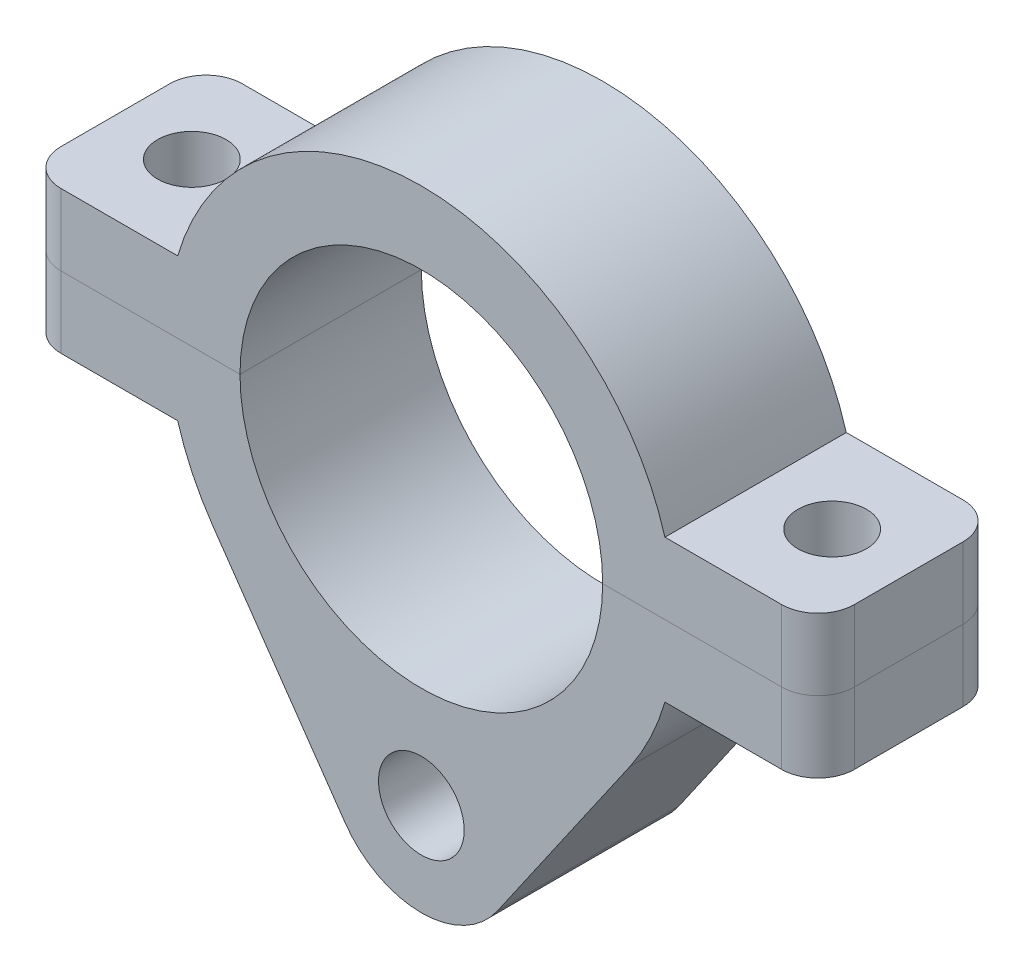
ISO-10303-21;
HEADER;
FILE_DESCRIPTION(('STEP AP214'),'2;1');
FILE_NAME('part.step','',(''),(''),'','','');
FILE_SCHEMA(('AUTOMOTIVE_DESIGN { 1 0 10303 214 1 1 1 1 }'));
ENDSEC;
DATA;
#1=APPLICATION_CONTEXT('core data for automotive mechanical design processes');
#2=APPLICATION_PROTOCOL_DEFINITION('international standard','automotive_design',2000,#1);
#3=PRODUCT_CONTEXT('',#1,'mechanical');
#4=PRODUCT('Part','Part','',(#3));
#5=PRODUCT_RELATED_PRODUCT_CATEGORY('part','',(#4));
#6=PRODUCT_DEFINITION_FORMATION('','',#4);
#7=PRODUCT_DEFINITION_CONTEXT('part definition',#1,'design');
#8=PRODUCT_DEFINITION('design','',#6,#7);
#9=PRODUCT_DEFINITION_SHAPE('','',#8);
#10=(LENGTH_UNIT() NAMED_UNIT(*) SI_UNIT(.MILLI.,.METRE.));
#11=(NAMED_UNIT(*) PLANE_ANGLE_UNIT() SI_UNIT($,.RADIAN.));
#12=(NAMED_UNIT(*) SI_UNIT($,.STERADIAN.) SOLID_ANGLE_UNIT());
#13=UNCERTAINTY_MEASURE_WITH_UNIT(LENGTH_MEASURE(1.E-05),#10,'distance_accuracy_value','');
#14=(GEOMETRIC_REPRESENTATION_CONTEXT(3) GLOBAL_UNCERTAINTY_ASSIGNED_CONTEXT((#13)) GLOBAL_UNIT_ASSIGNED_CONTEXT((#10,
#11,#12)) REPRESENTATION_CONTEXT('',''));
#15=CARTESIAN_POINT('',(0.,0.,0.));
#16=DIRECTION('',(0.,0.,1.));
#17=DIRECTION('',(1.,0.,0.));
#18=AXIS2_PLACEMENT_3D('',#15,#16,#17);
#19=CARTESIAN_POINT('',(0.,0.,0.));
#20=DIRECTION('',(0.,-1.,0.));
#21=DIRECTION('',(0.,0.,-1.));
#22=AXIS2_PLACEMENT_3D('',#19,#20,#21);
#23=PLANE('',#22);
#24=CARTESIAN_POINT('',(-22.4212425824144,0.,6.35));
#25=DIRECTION('',(0.,-1.,0.));
#26=DIRECTION('',(0.,0.,-1.));
#27=AXIS2_PLACEMENT_3D('',#24,#25,#26);
#28=CIRCLE('',#27,2.4);
#29=CARTESIAN_POINT('',(-22.4212425824144,0.,3.95));
#30=VERTEX_POINT('',#29);
#31=EDGE_CURVE('E179',#30,#30,#28,.F.);
#32=ORIENTED_EDGE('',*,*,#31,.T.);
#33=EDGE_LOOP('',(#32));
#34=FACE_BOUND('',#33,.T.);
#35=DIRECTION('',(1.,0.,0.));
#36=VECTOR('',#35,1.);
#37=CARTESIAN_POINT('',(0.,0.,12.7));
#38=LINE('',#37,#36);
#39=CARTESIAN_POINT('',(-25.24,0.,12.7));
#40=VERTEX_POINT('',#39);
#41=CARTESIAN_POINT('',(-12.7,0.,12.7));
#42=VERTEX_POINT('',#41);
#43=EDGE_CURVE('E172',#40,#42,#38,.T.);
#44=ORIENTED_EDGE('',*,*,#43,.F.);
#45=CARTESIAN_POINT('',(-25.24,0.,10.16));
#46=DIRECTION('',(0.,-1.,0.));
#47=DIRECTION('',(0.,0.,-1.));
#48=AXIS2_PLACEMENT_3D('',#45,#46,#47);
#49=CIRCLE('',#48,2.54);
#50=CARTESIAN_POINT('',(-27.78,0.,10.16));
#51=VERTEX_POINT('',#50);
#52=EDGE_CURVE('E236',#51,#40,#49,.F.);
#53=ORIENTED_EDGE('',*,*,#52,.F.);
#54=DIRECTION('',(0.,0.,1.));
#55=VECTOR('',#54,1.);
#56=CARTESIAN_POINT('',(-27.78,0.,12.7));
#57=LINE('',#56,#55);
#58=CARTESIAN_POINT('',(-27.78,0.,2.54));
#59=VERTEX_POINT('',#58);
#60=EDGE_CURVE('E239',#59,#51,#57,.T.);
#61=ORIENTED_EDGE('',*,*,#60,.F.);
#62=CARTESIAN_POINT('',(-25.24,0.,2.54));
#63=DIRECTION('',(0.,-1.,0.));
#64=DIRECTION('',(0.,0.,-1.));
#65=AXIS2_PLACEMENT_3D('',#62,#63,#64);
#66=CIRCLE('',#65,2.54);
#67=CARTESIAN_POINT('',(-25.24,0.,0.));
#68=VERTEX_POINT('',#67);
#69=EDGE_CURVE('E234',#68,#59,#66,.F.);
#70=ORIENTED_EDGE('',*,*,#69,.F.);
#71=DIRECTION('',(1.,0.,0.));
#72=VECTOR('',#71,1.);
#73=CARTESIAN_POINT('',(0.,0.,0.));
#74=LINE('',#73,#72);
#75=CARTESIAN_POINT('',(-12.7,0.,0.));
#76=VERTEX_POINT('',#75);
#77=EDGE_CURVE('E178',#68,#76,#74,.T.);
#78=ORIENTED_EDGE('',*,*,#77,.T.);
#79=DIRECTION('',(0.,0.,-1.));
#80=VECTOR('',#79,1.);
#81=CARTESIAN_POINT('',(-12.7,0.,12.7));
#82=LINE('',#81,#80);
#83=EDGE_CURVE('E158',#42,#76,#82,.T.);
#84=ORIENTED_EDGE('',*,*,#83,.F.);
#85=EDGE_LOOP('',(#44,#53,#61,#70,#78,#84));
#86=FACE_BOUND('',#85,.T.);
#87=ADVANCED_FACE('F53',(#34,#86),#23,.T.);
#88=CARTESIAN_POINT('',(22.4212425824144,0.,6.35));
#89=DIRECTION('',(0.,-1.,0.));
#90=DIRECTION('',(0.,0.,-1.));
#91=AXIS2_PLACEMENT_3D('',#88,#89,#90);
#92=CIRCLE('',#91,2.4);
#93=CARTESIAN_POINT('',(22.4212425824144,0.,3.95));
#94=VERTEX_POINT('',#93);
#95=EDGE_CURVE('E183',#94,#94,#92,.F.);
#96=ORIENTED_EDGE('',*,*,#95,.T.);
#97=EDGE_LOOP('',(#96));
#98=FACE_BOUND('',#97,.T.);
#99=CARTESIAN_POINT('',(12.7,0.,12.7));
#100=VERTEX_POINT('',#99);
#101=CARTESIAN_POINT('',(25.24,0.,12.7));
#102=VERTEX_POINT('',#101);
#103=EDGE_CURVE('E171',#100,#102,#38,.T.);
#104=ORIENTED_EDGE('',*,*,#103,.F.);
#105=DIRECTION('',(0.,0.,-1.));
#106=VECTOR('',#105,1.);
#107=CARTESIAN_POINT('',(12.7,0.,12.7));
#108=LINE('',#107,#106);
#109=CARTESIAN_POINT('',(12.7,0.,0.));
#110=VERTEX_POINT('',#109);
#111=EDGE_CURVE('E155',#110,#100,#108,.F.);
#112=ORIENTED_EDGE('',*,*,#111,.F.);
#113=CARTESIAN_POINT('',(25.24,0.,0.));
#114=VERTEX_POINT('',#113);
#115=EDGE_CURVE('E168',#110,#114,#74,.T.);
#116=ORIENTED_EDGE('',*,*,#115,.T.);
#117=CARTESIAN_POINT('',(25.24,0.,2.54));
#118=DIRECTION('',(0.,-1.,0.));
#119=DIRECTION('',(0.,0.,-1.));
#120=AXIS2_PLACEMENT_3D('',#117,#118,#119);
#121=CIRCLE('',#120,2.54);
#122=CARTESIAN_POINT('',(27.78,0.,2.54));
#123=VERTEX_POINT('',#122);
#124=EDGE_CURVE('E194',#123,#114,#121,.F.);
#125=ORIENTED_EDGE('',*,*,#124,.F.);
#126=DIRECTION('',(0.,0.,1.));
#127=VECTOR('',#126,1.);
#128=CARTESIAN_POINT('',(27.78,0.,12.7));
#129=LINE('',#128,#127);
#130=CARTESIAN_POINT('',(27.78,0.,10.16));
#131=VERTEX_POINT('',#130);
#132=EDGE_CURVE('E181',#123,#131,#129,.T.);
#133=ORIENTED_EDGE('',*,*,#132,.T.);
#134=CARTESIAN_POINT('',(25.24,0.,10.16));
#135=DIRECTION('',(0.,-1.,0.));
#136=DIRECTION('',(0.,0.,-1.));
#137=AXIS2_PLACEMENT_3D('',#134,#135,#136);
#138=CIRCLE('',#137,2.54);
#139=EDGE_CURVE('E232',#102,#131,#138,.F.);
#140=ORIENTED_EDGE('',*,*,#139,.F.);
#141=EDGE_LOOP('',(#104,#112,#116,#125,#133,#140));
#142=FACE_BOUND('',#141,.T.);
#143=ADVANCED_FACE('F167',(#98,#142),#23,.T.);
#144=CARTESIAN_POINT('',(0.,0.,12.7));
#145=DIRECTION('',(0.,0.,-1.));
#146=DIRECTION('',(-1.,0.,0.));
#147=AXIS2_PLACEMENT_3D('',#144,#145,#146);
#148=CYLINDRICAL_SURFACE('',#147,12.7);
#149=CARTESIAN_POINT('',(0.,0.,12.7));
#150=DIRECTION('',(0.,0.,1.));
#151=DIRECTION('',(1.,0.,0.));
#152=AXIS2_PLACEMENT_3D('',#149,#150,#151);
#153=CIRCLE('',#152,12.7);
#154=EDGE_CURVE('E212',#100,#42,#153,.T.);
#155=ORIENTED_EDGE('',*,*,#154,.T.);
#156=ORIENTED_EDGE('',*,*,#83,.T.);
#157=CARTESIAN_POINT('',(0.,0.,0.));
#158=DIRECTION('',(0.,0.,1.));
#159=DIRECTION('',(1.,0.,0.));
#160=AXIS2_PLACEMENT_3D('',#157,#158,#159);
#161=CIRCLE('',#160,12.7);
#162=EDGE_CURVE('E57',#110,#76,#161,.T.);
#163=ORIENTED_EDGE('',*,*,#162,.F.);
#164=ORIENTED_EDGE('',*,*,#111,.T.);
#165=EDGE_LOOP('',(#155,#156,#163,#164));
#166=FACE_BOUND('',#165,.T.);
#167=ADVANCED_FACE('F154',(#166),#148,.F.);
#168=CARTESIAN_POINT('',(0.,0.,12.7));
#169=DIRECTION('',(0.,0.,-1.));
#170=DIRECTION('',(-1.,0.,0.));
#171=AXIS2_PLACEMENT_3D('',#168,#169,#170);
#172=CYLINDRICAL_SURFACE('',#171,17.78);
#173=CARTESIAN_POINT('',(0.,0.,0.));
#174=DIRECTION('',(0.,0.,1.));
#175=DIRECTION('',(1.,0.,0.));
#176=AXIS2_PLACEMENT_3D('',#173,#174,#175);
#177=CIRCLE('',#176,17.78);
#178=CARTESIAN_POINT('',(17.0624851648287,5.,0.));
#179=VERTEX_POINT('',#178);
#180=CARTESIAN_POINT('',(-17.0624851648287,5.,0.));
#181=VERTEX_POINT('',#180);
#182=EDGE_CURVE('E224',#179,#181,#177,.T.);
#183=ORIENTED_EDGE('',*,*,#182,.T.);
#184=DIRECTION('',(0.,0.,-1.));
#185=VECTOR('',#184,1.);
#186=CARTESIAN_POINT('',(-17.0624851648287,5.,12.7));
#187=LINE('',#186,#185);
#188=CARTESIAN_POINT('',(-17.0624851648287,5.,12.7));
#189=VERTEX_POINT('',#188);
#190=EDGE_CURVE('E216',#189,#181,#187,.T.);
#191=ORIENTED_EDGE('',*,*,#190,.F.);
#192=CARTESIAN_POINT('',(0.,0.,12.7));
#193=DIRECTION('',(0.,0.,1.));
#194=DIRECTION('',(1.,0.,0.));
#195=AXIS2_PLACEMENT_3D('',#192,#193,#194);
#196=CIRCLE('',#195,17.78);
#197=CARTESIAN_POINT('',(17.0624851648287,5.,12.7));
#198=VERTEX_POINT('',#197);
#199=EDGE_CURVE('E214',#198,#189,#196,.T.);
#200=ORIENTED_EDGE('',*,*,#199,.F.);
#201=DIRECTION('',(0.,0.,-1.));
#202=VECTOR('',#201,1.);
#203=CARTESIAN_POINT('',(17.0624851648287,5.,12.7));
#204=LINE('',#203,#202);
#205=EDGE_CURVE('E72',#198,#179,#204,.T.);
#206=ORIENTED_EDGE('',*,*,#205,.T.);
#207=EDGE_LOOP('',(#183,#191,#200,#206));
#208=FACE_BOUND('',#207,.T.);
#209=ADVANCED_FACE('F285',(#208),#172,.T.);
#210=CARTESIAN_POINT('',(0.,5.,12.7));
#211=DIRECTION('',(0.,1.,0.));
#212=DIRECTION('',(0.,0.,1.));
#213=AXIS2_PLACEMENT_3D('',#210,#211,#212);
#214=PLANE('',#213);
#215=CARTESIAN_POINT('',(-22.4212425824144,5.,6.35));
#216=DIRECTION('',(0.,1.,0.));
#217=DIRECTION('',(0.,0.,1.));
#218=AXIS2_PLACEMENT_3D('',#215,#216,#217);
#219=CIRCLE('',#218,2.4);
#220=CARTESIAN_POINT('',(-22.4212425824144,5.,8.75));
#221=VERTEX_POINT('',#220);
#222=EDGE_CURVE('E63',#221,#221,#219,.T.);
#223=ORIENTED_EDGE('',*,*,#222,.F.);
#224=EDGE_LOOP('',(#223));
#225=FACE_BOUND('',#224,.T.);
#226=DIRECTION('',(0.,0.,-1.));
#227=VECTOR('',#226,1.);
#228=CARTESIAN_POINT('',(-27.78,5.,12.7));
#229=LINE('',#228,#227);
#230=CARTESIAN_POINT('',(-27.78,5.,10.16));
#231=VERTEX_POINT('',#230);
#232=CARTESIAN_POINT('',(-27.78,5.,2.54));
#233=VERTEX_POINT('',#232);
#234=EDGE_CURVE('E213',#231,#233,#229,.T.);
#235=ORIENTED_EDGE('',*,*,#234,.F.);
#236=CARTESIAN_POINT('',(-25.24,5.,10.16));
#237=DIRECTION('',(0.,1.,0.));
#238=DIRECTION('',(0.,0.,1.));
#239=AXIS2_PLACEMENT_3D('',#236,#237,#238);
#240=CIRCLE('',#239,2.54);
#241=CARTESIAN_POINT('',(-25.24,5.,12.7));
#242=VERTEX_POINT('',#241);
#243=EDGE_CURVE('E206',#231,#242,#240,.T.);
#244=ORIENTED_EDGE('',*,*,#243,.T.);
#245=DIRECTION('',(1.,0.,0.));
#246=VECTOR('',#245,1.);
#247=CARTESIAN_POINT('',(0.,5.,12.7));
#248=LINE('',#247,#246);
#249=EDGE_CURVE('E84',#242,#189,#248,.T.);
#250=ORIENTED_EDGE('',*,*,#249,.T.);
#251=ORIENTED_EDGE('',*,*,#190,.T.);
#252=DIRECTION('',(1.,0.,0.));
#253=VECTOR('',#252,1.);
#254=CARTESIAN_POINT('',(0.,5.,0.));
#255=LINE('',#254,#253);
#256=CARTESIAN_POINT('',(-25.24,5.,0.));
#257=VERTEX_POINT('',#256);
#258=EDGE_CURVE('E163',#257,#181,#255,.T.);
#259=ORIENTED_EDGE('',*,*,#258,.F.);
#260=CARTESIAN_POINT('',(-25.24,5.,2.54));
#261=DIRECTION('',(0.,1.,0.));
#262=DIRECTION('',(0.,0.,1.));
#263=AXIS2_PLACEMENT_3D('',#260,#261,#262);
#264=CIRCLE('',#263,2.54);
#265=EDGE_CURVE('E209',#257,#233,#264,.T.);
#266=ORIENTED_EDGE('',*,*,#265,.T.);
#267=EDGE_LOOP('',(#235,#244,#250,#251,#259,#266));
#268=FACE_BOUND('',#267,.T.);
#269=ADVANCED_FACE('F265',(#225,#268),#214,.T.);
#270=CARTESIAN_POINT('',(-27.78,0.,12.7));
#271=DIRECTION('',(-1.,0.,0.));
#272=DIRECTION('',(0.,0.,1.));
#273=AXIS2_PLACEMENT_3D('',#270,#271,#272);
#274=PLANE('',#273);
#275=DIRECTION('',(0.,1.,0.));
#276=VECTOR('',#275,1.);
#277=CARTESIAN_POINT('',(-27.78,-5.,2.54));
#278=LINE('',#277,#276);
#279=EDGE_CURVE('E208',#233,#59,#278,.F.);
#280=ORIENTED_EDGE('',*,*,#279,.T.);
#281=ORIENTED_EDGE('',*,*,#60,.T.);
#282=DIRECTION('',(0.,1.,0.));
#283=VECTOR('',#282,1.);
#284=CARTESIAN_POINT('',(-27.78,0.,10.16));
#285=LINE('',#284,#283);
#286=EDGE_CURVE('E92',#51,#231,#285,.T.);
#287=ORIENTED_EDGE('',*,*,#286,.T.);
#288=ORIENTED_EDGE('',*,*,#234,.T.);
#289=EDGE_LOOP('',(#280,#281,#287,#288));
#290=FACE_BOUND('',#289,.T.);
#291=ADVANCED_FACE('F284',(#290),#274,.T.);
#292=CARTESIAN_POINT('',(0.,5.,12.7));
#293=DIRECTION('',(0.,1.,0.));
#294=DIRECTION('',(0.,0.,1.));
#295=AXIS2_PLACEMENT_3D('',#292,#293,#294);
#296=PLANE('',#295);
#297=CARTESIAN_POINT('',(22.4212425824144,5.,6.35));
#298=DIRECTION('',(0.,1.,0.));
#299=DIRECTION('',(0.,0.,1.));
#300=AXIS2_PLACEMENT_3D('',#297,#298,#299);
#301=CIRCLE('',#300,2.4);
#302=CARTESIAN_POINT('',(22.4212425824144,5.,8.75));
#303=VERTEX_POINT('',#302);
#304=EDGE_CURVE('E13',#303,#303,#301,.T.);
#305=ORIENTED_EDGE('',*,*,#304,.F.);
#306=EDGE_LOOP('',(#305));
#307=FACE_BOUND('',#306,.T.);
#308=DIRECTION('',(1.,0.,0.));
#309=VECTOR('',#308,1.);
#310=CARTESIAN_POINT('',(0.,5.,12.7));
#311=LINE('',#310,#309);
#312=CARTESIAN_POINT('',(25.24,5.,12.7));
#313=VERTEX_POINT('',#312);
#314=EDGE_CURVE('E164',#198,#313,#311,.T.);
#315=ORIENTED_EDGE('',*,*,#314,.T.);
#316=CARTESIAN_POINT('',(25.24,5.,10.16));
#317=DIRECTION('',(0.,1.,0.));
#318=DIRECTION('',(0.,0.,1.));
#319=AXIS2_PLACEMENT_3D('',#316,#317,#318);
#320=CIRCLE('',#319,2.54);
#321=CARTESIAN_POINT('',(27.78,5.,10.16));
#322=VERTEX_POINT('',#321);
#323=EDGE_CURVE('E196',#313,#322,#320,.T.);
#324=ORIENTED_EDGE('',*,*,#323,.T.);
#325=DIRECTION('',(0.,0.,-1.));
#326=VECTOR('',#325,1.);
#327=CARTESIAN_POINT('',(27.78,5.,12.7));
#328=LINE('',#327,#326);
#329=CARTESIAN_POINT('',(27.78,5.,2.54));
#330=VERTEX_POINT('',#329);
#331=EDGE_CURVE('E211',#322,#330,#328,.T.);
#332=ORIENTED_EDGE('',*,*,#331,.T.);
#333=CARTESIAN_POINT('',(25.24,5.,2.54));
#334=DIRECTION('',(0.,1.,0.));
#335=DIRECTION('',(0.,0.,1.));
#336=AXIS2_PLACEMENT_3D('',#333,#334,#335);
#337=CIRCLE('',#336,2.54);
#338=CARTESIAN_POINT('',(25.24,5.,0.));
#339=VERTEX_POINT('',#338);
#340=EDGE_CURVE('E199',#330,#339,#337,.T.);
#341=ORIENTED_EDGE('',*,*,#340,.T.);
#342=DIRECTION('',(1.,0.,0.));
#343=VECTOR('',#342,1.);
#344=CARTESIAN_POINT('',(0.,5.,0.));
#345=LINE('',#344,#343);
#346=EDGE_CURVE('E226',#179,#339,#345,.T.);
#347=ORIENTED_EDGE('',*,*,#346,.F.);
#348=ORIENTED_EDGE('',*,*,#205,.F.);
#349=EDGE_LOOP('',(#315,#324,#332,#341,#347,#348));
#350=FACE_BOUND('',#349,.T.);
#351=ADVANCED_FACE('F269',(#307,#350),#296,.T.);
#352=CARTESIAN_POINT('',(0.,0.,0.));
#353=DIRECTION('',(0.,0.,1.));
#354=DIRECTION('',(1.,0.,0.));
#355=AXIS2_PLACEMENT_3D('',#352,#353,#354);
#356=PLANE('',#355);
#357=ORIENTED_EDGE('',*,*,#77,.F.);
#358=DIRECTION('',(0.,1.,0.));
#359=VECTOR('',#358,1.);
#360=CARTESIAN_POINT('',(-25.24,5.,0.));
#361=LINE('',#360,#359);
#362=EDGE_CURVE('E197',#68,#257,#361,.T.);
#363=ORIENTED_EDGE('',*,*,#362,.T.);
#364=ORIENTED_EDGE('',*,*,#258,.T.);
#365=ORIENTED_EDGE('',*,*,#182,.F.);
#366=ORIENTED_EDGE('',*,*,#346,.T.);
#367=DIRECTION('',(0.,1.,0.));
#368=VECTOR('',#367,1.);
#369=CARTESIAN_POINT('',(25.24,0.,0.));
#370=LINE('',#369,#368);
#371=EDGE_CURVE('E177',#339,#114,#370,.F.);
#372=ORIENTED_EDGE('',*,*,#371,.T.);
#373=ORIENTED_EDGE('',*,*,#115,.F.);
#374=ORIENTED_EDGE('',*,*,#162,.T.);
#375=EDGE_LOOP('',(#357,#363,#364,#365,#366,#372,#373,#374));
#376=FACE_BOUND('',#375,.T.);
#377=ADVANCED_FACE('F174',(#376),#356,.F.);
#378=CARTESIAN_POINT('',(27.78,0.,12.7));
#379=DIRECTION('',(-1.,0.,0.));
#380=DIRECTION('',(0.,0.,1.));
#381=AXIS2_PLACEMENT_3D('',#378,#379,#380);
#382=PLANE('',#381);
#383=ORIENTED_EDGE('',*,*,#132,.F.);
#384=DIRECTION('',(0.,1.,0.));
#385=VECTOR('',#384,1.);
#386=CARTESIAN_POINT('',(27.78,0.,2.54));
#387=LINE('',#386,#385);
#388=EDGE_CURVE('E193',#123,#330,#387,.T.);
#389=ORIENTED_EDGE('',*,*,#388,.T.);
#390=ORIENTED_EDGE('',*,*,#331,.F.);
#391=DIRECTION('',(0.,1.,0.));
#392=VECTOR('',#391,1.);
#393=CARTESIAN_POINT('',(27.78,-5.,10.16));
#394=LINE('',#393,#392);
#395=EDGE_CURVE('E190',#322,#131,#394,.F.);
#396=ORIENTED_EDGE('',*,*,#395,.T.);
#397=EDGE_LOOP('',(#383,#389,#390,#396));
#398=FACE_BOUND('',#397,.T.);
#399=ADVANCED_FACE('F247',(#398),#382,.F.);
#400=CARTESIAN_POINT('',(25.24,0.,2.54));
#401=DIRECTION('',(0.,1.,0.));
#402=DIRECTION('',(0.,0.,1.));
#403=AXIS2_PLACEMENT_3D('',#400,#401,#402);
#404=CYLINDRICAL_SURFACE('',#403,2.54);
#405=ORIENTED_EDGE('',*,*,#388,.F.);
#406=ORIENTED_EDGE('',*,*,#124,.T.);
#407=ORIENTED_EDGE('',*,*,#371,.F.);
#408=ORIENTED_EDGE('',*,*,#340,.F.);
#409=EDGE_LOOP('',(#405,#406,#407,#408));
#410=FACE_BOUND('',#409,.T.);
#411=ADVANCED_FACE('F55',(#410),#404,.T.);
#412=CARTESIAN_POINT('',(0.,0.,12.7));
#413=DIRECTION('',(0.,0.,1.));
#414=DIRECTION('',(1.,0.,0.));
#415=AXIS2_PLACEMENT_3D('',#412,#413,#414);
#416=PLANE('',#415);
#417=DIRECTION('',(0.,1.,0.));
#418=VECTOR('',#417,1.);
#419=CARTESIAN_POINT('',(-25.24,0.,12.7));
#420=LINE('',#419,#418);
#421=EDGE_CURVE('E201',#242,#40,#420,.F.);
#422=ORIENTED_EDGE('',*,*,#421,.T.);
#423=ORIENTED_EDGE('',*,*,#43,.T.);
#424=ORIENTED_EDGE('',*,*,#154,.F.);
#425=ORIENTED_EDGE('',*,*,#103,.T.);
#426=DIRECTION('',(0.,1.,0.));
#427=VECTOR('',#426,1.);
#428=CARTESIAN_POINT('',(25.24,5.,12.7));
#429=LINE('',#428,#427);
#430=EDGE_CURVE('E204',#102,#313,#429,.T.);
#431=ORIENTED_EDGE('',*,*,#430,.T.);
#432=ORIENTED_EDGE('',*,*,#314,.F.);
#433=ORIENTED_EDGE('',*,*,#199,.T.);
#434=ORIENTED_EDGE('',*,*,#249,.F.);
#435=EDGE_LOOP('',(#422,#423,#424,#425,#431,#432,#433,#434));
#436=FACE_BOUND('',#435,.T.);
#437=ADVANCED_FACE('F255',(#436),#416,.T.);
#438=CARTESIAN_POINT('',(25.24,0.,10.16));
#439=DIRECTION('',(0.,-1.,0.));
#440=DIRECTION('',(0.,0.,-1.));
#441=AXIS2_PLACEMENT_3D('',#438,#439,#440);
#442=CYLINDRICAL_SURFACE('',#441,2.54);
#443=ORIENTED_EDGE('',*,*,#430,.F.);
#444=ORIENTED_EDGE('',*,*,#139,.T.);
#445=ORIENTED_EDGE('',*,*,#395,.F.);
#446=ORIENTED_EDGE('',*,*,#323,.F.);
#447=EDGE_LOOP('',(#443,#444,#445,#446));
#448=FACE_BOUND('',#447,.T.);
#449=ADVANCED_FACE('F252',(#448),#442,.T.);
#450=CARTESIAN_POINT('',(-25.24,0.,2.54));
#451=DIRECTION('',(0.,-1.,0.));
#452=DIRECTION('',(0.,0.,-1.));
#453=AXIS2_PLACEMENT_3D('',#450,#451,#452);
#454=CYLINDRICAL_SURFACE('',#453,2.54);
#455=ORIENTED_EDGE('',*,*,#362,.F.);
#456=ORIENTED_EDGE('',*,*,#69,.T.);
#457=ORIENTED_EDGE('',*,*,#279,.F.);
#458=ORIENTED_EDGE('',*,*,#265,.F.);
#459=EDGE_LOOP('',(#455,#456,#457,#458));
#460=FACE_BOUND('',#459,.T.);
#461=ADVANCED_FACE('F262',(#460),#454,.T.);
#462=CARTESIAN_POINT('',(-25.24,0.,10.16));
#463=DIRECTION('',(0.,1.,0.));
#464=DIRECTION('',(0.,0.,1.));
#465=AXIS2_PLACEMENT_3D('',#462,#463,#464);
#466=CYLINDRICAL_SURFACE('',#465,2.54);
#467=ORIENTED_EDGE('',*,*,#286,.F.);
#468=ORIENTED_EDGE('',*,*,#52,.T.);
#469=ORIENTED_EDGE('',*,*,#421,.F.);
#470=ORIENTED_EDGE('',*,*,#243,.F.);
#471=EDGE_LOOP('',(#467,#468,#469,#470));
#472=FACE_BOUND('',#471,.T.);
#473=ADVANCED_FACE('F311',(#472),#466,.T.);
#474=CARTESIAN_POINT('',(22.4212425824144,-5.,6.35));
#475=DIRECTION('',(0.,-1.,0.));
#476=DIRECTION('',(0.,0.,-1.));
#477=AXIS2_PLACEMENT_3D('',#474,#475,#476);
#478=CYLINDRICAL_SURFACE('',#477,2.4);
#479=ORIENTED_EDGE('',*,*,#304,.T.);
#480=EDGE_LOOP('',(#479));
#481=FACE_BOUND('',#480,.T.);
#482=ORIENTED_EDGE('',*,*,#95,.F.);
#483=EDGE_LOOP('',(#482));
#484=FACE_BOUND('',#483,.T.);
#485=ADVANCED_FACE('F308',(#481,#484),#478,.F.);
#486=CARTESIAN_POINT('',(-22.4212425824144,-5.,6.35));
#487=DIRECTION('',(0.,-1.,0.));
#488=DIRECTION('',(0.,0.,-1.));
#489=AXIS2_PLACEMENT_3D('',#486,#487,#488);
#490=CYLINDRICAL_SURFACE('',#489,2.4);
#491=ORIENTED_EDGE('',*,*,#222,.T.);
#492=EDGE_LOOP('',(#491));
#493=FACE_BOUND('',#492,.T.);
#494=ORIENTED_EDGE('',*,*,#31,.F.);
#495=EDGE_LOOP('',(#494));
#496=FACE_BOUND('',#495,.T.);
#497=ADVANCED_FACE('F280',(#493,#496),#490,.F.);
#498=CLOSED_SHELL('',(#87,#143,#167,#209,#269,#291,#351,#377,#399,#411,#437,#449,#461,#473,#485,#497));
#499=MANIFOLD_SOLID_BREP('B2',#498);
#500=CARTESIAN_POINT('',(0.,0.,0.));
#501=DIRECTION('',(0.,-1.,0.));
#502=DIRECTION('',(0.,0.,-1.));
#503=AXIS2_PLACEMENT_3D('',#500,#501,#502);
#504=PLANE('',#503);
#505=DIRECTION('',(1.,0.,0.));
#506=VECTOR('',#505,1.);
#507=CARTESIAN_POINT('',(0.,0.,12.7));
#508=LINE('',#507,#506);
#509=CARTESIAN_POINT('',(-25.24,0.,12.7));
#510=VERTEX_POINT('',#509);
#511=CARTESIAN_POINT('',(-12.7,0.,12.7));
#512=VERTEX_POINT('',#511);
#513=EDGE_CURVE('E713',#510,#512,#508,.T.);
#514=ORIENTED_EDGE('',*,*,#513,.T.);
#515=DIRECTION('',(0.,0.,-1.));
#516=VECTOR('',#515,1.);
#517=CARTESIAN_POINT('',(-12.7,0.,12.7));
#518=LINE('',#517,#516);
#519=CARTESIAN_POINT('',(-12.7,0.,0.));
#520=VERTEX_POINT('',#519);
#521=EDGE_CURVE('E714',#512,#520,#518,.T.);
#522=ORIENTED_EDGE('',*,*,#521,.T.);
#523=DIRECTION('',(1.,0.,0.));
#524=VECTOR('',#523,1.);
#525=CARTESIAN_POINT('',(0.,0.,0.));
#526=LINE('',#525,#524);
#527=CARTESIAN_POINT('',(-25.24,0.,0.));
#528=VERTEX_POINT('',#527);
#529=EDGE_CURVE('E708',#528,#520,#526,.T.);
#530=ORIENTED_EDGE('',*,*,#529,.F.);
#531=CARTESIAN_POINT('',(-25.24,0.,2.54));
#532=DIRECTION('',(0.,-1.,0.));
#533=DIRECTION('',(0.,0.,-1.));
#534=AXIS2_PLACEMENT_3D('',#531,#532,#533);
#535=CIRCLE('',#534,2.54);
#536=CARTESIAN_POINT('',(-27.78,0.,2.54));
#537=VERTEX_POINT('',#536);
#538=EDGE_CURVE('E719',#528,#537,#535,.F.);
#539=ORIENTED_EDGE('',*,*,#538,.T.);
#540=DIRECTION('',(0.,0.,1.));
#541=VECTOR('',#540,1.);
#542=CARTESIAN_POINT('',(-27.78,0.,12.7));
#543=LINE('',#542,#541);
#544=CARTESIAN_POINT('',(-27.78,0.,10.16));
#545=VERTEX_POINT('',#544);
#546=EDGE_CURVE('E716',#537,#545,#543,.T.);
#547=ORIENTED_EDGE('',*,*,#546,.T.);
#548=CARTESIAN_POINT('',(-25.24,0.,10.16));
#549=DIRECTION('',(0.,-1.,0.));
#550=DIRECTION('',(0.,0.,-1.));
#551=AXIS2_PLACEMENT_3D('',#548,#549,#550);
#552=CIRCLE('',#551,2.54);
#553=EDGE_CURVE('E723',#545,#510,#552,.F.);
#554=ORIENTED_EDGE('',*,*,#553,.T.);
#555=EDGE_LOOP('',(#514,#522,#530,#539,#547,#554));
#556=FACE_BOUND('',#555,.T.);
#557=CARTESIAN_POINT('',(-22.4212425824144,0.,6.35));
#558=DIRECTION('',(0.,-1.,0.));
#559=DIRECTION('',(0.,0.,-1.));
#560=AXIS2_PLACEMENT_3D('',#557,#558,#559);
#561=CIRCLE('',#560,2.4);
#562=CARTESIAN_POINT('',(-22.4212425824144,0.,3.95));
#563=VERTEX_POINT('',#562);
#564=EDGE_CURVE('E533',#563,#563,#561,.F.);
#565=ORIENTED_EDGE('',*,*,#564,.F.);
#566=EDGE_LOOP('',(#565));
#567=FACE_BOUND('',#566,.T.);
#568=ADVANCED_FACE('F530',(#556,#567),#504,.F.);
#569=CARTESIAN_POINT('',(12.7,0.,12.7));
#570=VERTEX_POINT('',#569);
#571=CARTESIAN_POINT('',(25.24,0.,12.7));
#572=VERTEX_POINT('',#571);
#573=EDGE_CURVE('E720',#570,#572,#508,.T.);
#574=ORIENTED_EDGE('',*,*,#573,.T.);
#575=CARTESIAN_POINT('',(25.24,0.,10.16));
#576=DIRECTION('',(0.,-1.,0.));
#577=DIRECTION('',(0.,0.,-1.));
#578=AXIS2_PLACEMENT_3D('',#575,#576,#577);
#579=CIRCLE('',#578,2.54);
#580=CARTESIAN_POINT('',(27.78,0.,10.16));
#581=VERTEX_POINT('',#580);
#582=EDGE_CURVE('E538',#572,#581,#579,.F.);
#583=ORIENTED_EDGE('',*,*,#582,.T.);
#584=DIRECTION('',(0.,0.,1.));
#585=VECTOR('',#584,1.);
#586=CARTESIAN_POINT('',(27.78,0.,12.7));
#587=LINE('',#586,#585);
#588=CARTESIAN_POINT('',(27.78,0.,2.54));
#589=VERTEX_POINT('',#588);
#590=EDGE_CURVE('E710',#589,#581,#587,.T.);
#591=ORIENTED_EDGE('',*,*,#590,.F.);
#592=CARTESIAN_POINT('',(25.24,0.,2.54));
#593=DIRECTION('',(0.,-1.,0.));
#594=DIRECTION('',(0.,0.,-1.));
#595=AXIS2_PLACEMENT_3D('',#592,#593,#594);
#596=CIRCLE('',#595,2.54);
#597=CARTESIAN_POINT('',(25.24,0.,0.));
#598=VERTEX_POINT('',#597);
#599=EDGE_CURVE('E51',#589,#598,#596,.F.);
#600=ORIENTED_EDGE('',*,*,#599,.T.);
#601=CARTESIAN_POINT('',(12.7,0.,0.));
#602=VERTEX_POINT('',#601);
#603=EDGE_CURVE('E546',#602,#598,#526,.T.);
#604=ORIENTED_EDGE('',*,*,#603,.F.);
#605=DIRECTION('',(0.,0.,-1.));
#606=VECTOR('',#605,1.);
#607=CARTESIAN_POINT('',(12.7,0.,12.7));
#608=LINE('',#607,#606);
#609=EDGE_CURVE('E711',#602,#570,#608,.F.);
#610=ORIENTED_EDGE('',*,*,#609,.T.);
#611=EDGE_LOOP('',(#574,#583,#591,#600,#604,#610));
#612=FACE_BOUND('',#611,.T.);
#613=CARTESIAN_POINT('',(22.4212425824144,0.,6.35));
#614=DIRECTION('',(0.,-1.,0.));
#615=DIRECTION('',(0.,0.,-1.));
#616=AXIS2_PLACEMENT_3D('',#613,#614,#615);
#617=CIRCLE('',#616,2.4);
#618=CARTESIAN_POINT('',(22.4212425824144,0.,3.95));
#619=VERTEX_POINT('',#618);
#620=EDGE_CURVE('E706',#619,#619,#617,.F.);
#621=ORIENTED_EDGE('',*,*,#620,.F.);
#622=EDGE_LOOP('',(#621));
#623=FACE_BOUND('',#622,.T.);
#624=ADVANCED_FACE('F740',(#612,#623),#504,.F.);
#625=CARTESIAN_POINT('',(0.,0.,12.7));
#626=DIRECTION('',(0.,0.,-1.));
#627=DIRECTION('',(-1.,0.,0.));
#628=AXIS2_PLACEMENT_3D('',#625,#626,#627);
#629=CYLINDRICAL_SURFACE('',#628,17.78);
#630=CARTESIAN_POINT('',(0.,0.,0.));
#631=DIRECTION('',(0.,0.,1.));
#632=DIRECTION('',(1.,0.,0.));
#633=AXIS2_PLACEMENT_3D('',#630,#631,#632);
#634=CIRCLE('',#633,17.78);
#635=CARTESIAN_POINT('',(14.6168298070911,-10.1230769230769,0.));
#636=VERTEX_POINT('',#635);
#637=CARTESIAN_POINT('',(17.0624851648287,-5.,0.));
#638=VERTEX_POINT('',#637);
#639=EDGE_CURVE('E673',#636,#638,#634,.T.);
#640=ORIENTED_EDGE('',*,*,#639,.T.);
#641=DIRECTION('',(0.,0.,-1.));
#642=VECTOR('',#641,1.);
#643=CARTESIAN_POINT('',(17.0624851648287,-5.,12.7));
#644=LINE('',#643,#642);
#645=CARTESIAN_POINT('',(17.0624851648287,-5.,12.7));
#646=VERTEX_POINT('',#645);
#647=EDGE_CURVE('E650',#646,#638,#644,.T.);
#648=ORIENTED_EDGE('',*,*,#647,.F.);
#649=CARTESIAN_POINT('',(0.,0.,12.7));
#650=DIRECTION('',(0.,0.,1.));
#651=DIRECTION('',(1.,0.,0.));
#652=AXIS2_PLACEMENT_3D('',#649,#650,#651);
#653=CIRCLE('',#652,17.78);
#654=CARTESIAN_POINT('',(14.6168298070911,-10.1230769230769,12.7));
#655=VERTEX_POINT('',#654);
#656=EDGE_CURVE('E658',#655,#646,#653,.T.);
#657=ORIENTED_EDGE('',*,*,#656,.F.);
#658=DIRECTION('',(0.,0.,-1.));
#659=VECTOR('',#658,1.);
#660=CARTESIAN_POINT('',(14.6168298070911,-10.1230769230769,12.7));
#661=LINE('',#660,#659);
#662=EDGE_CURVE('E756',#655,#636,#661,.T.);
#663=ORIENTED_EDGE('',*,*,#662,.T.);
#664=EDGE_LOOP('',(#640,#648,#657,#663));
#665=FACE_BOUND('',#664,.T.);
#666=ADVANCED_FACE('F671',(#665),#629,.T.);
#667=CARTESIAN_POINT('',(0.,-5.,12.7));
#668=DIRECTION('',(0.,1.,0.));
#669=DIRECTION('',(0.,0.,1.));
#670=AXIS2_PLACEMENT_3D('',#667,#668,#669);
#671=PLANE('',#670);
#672=CARTESIAN_POINT('',(22.4212425824144,-5.,6.35));
#673=DIRECTION('',(0.,-1.,0.));
#674=DIRECTION('',(0.,0.,-1.));
#675=AXIS2_PLACEMENT_3D('',#672,#673,#674);
#676=CIRCLE('',#675,2.4);
#677=CARTESIAN_POINT('',(22.4212425824144,-5.,3.95));
#678=VERTEX_POINT('',#677);
#679=EDGE_CURVE('E1129',#678,#678,#676,.T.);
#680=ORIENTED_EDGE('',*,*,#679,.F.);
#681=EDGE_LOOP('',(#680));
#682=FACE_BOUND('',#681,.T.);
#683=DIRECTION('',(0.,0.,-1.));
#684=VECTOR('',#683,1.);
#685=CARTESIAN_POINT('',(27.78,-5.,12.7));
#686=LINE('',#685,#684);
#687=CARTESIAN_POINT('',(27.78,-5.,10.16));
#688=VERTEX_POINT('',#687);
#689=CARTESIAN_POINT('',(27.78,-5.,2.54));
#690=VERTEX_POINT('',#689);
#691=EDGE_CURVE('E675',#688,#690,#686,.T.);
#692=ORIENTED_EDGE('',*,*,#691,.F.);
#693=CARTESIAN_POINT('',(25.24,-5.,10.16));
#694=DIRECTION('',(0.,1.,0.));
#695=DIRECTION('',(0.,0.,1.));
#696=AXIS2_PLACEMENT_3D('',#693,#694,#695);
#697=CIRCLE('',#696,2.54);
#698=CARTESIAN_POINT('',(25.24,-5.,12.7));
#699=VERTEX_POINT('',#698);
#700=EDGE_CURVE('E653',#688,#699,#697,.F.);
#701=ORIENTED_EDGE('',*,*,#700,.T.);
#702=DIRECTION('',(1.,0.,0.));
#703=VECTOR('',#702,1.);
#704=CARTESIAN_POINT('',(0.,-5.,12.7));
#705=LINE('',#704,#703);
#706=EDGE_CURVE('E644',#646,#699,#705,.T.);
#707=ORIENTED_EDGE('',*,*,#706,.F.);
#708=ORIENTED_EDGE('',*,*,#647,.T.);
#709=DIRECTION('',(1.,0.,0.));
#710=VECTOR('',#709,1.);
#711=CARTESIAN_POINT('',(0.,-5.,0.));
#712=LINE('',#711,#710);
#713=CARTESIAN_POINT('',(25.24,-5.,0.));
#714=VERTEX_POINT('',#713);
#715=EDGE_CURVE('E769',#638,#714,#712,.T.);
#716=ORIENTED_EDGE('',*,*,#715,.T.);
#717=CARTESIAN_POINT('',(25.24,-5.,2.54));
#718=DIRECTION('',(0.,1.,0.));
#719=DIRECTION('',(0.,0.,1.));
#720=AXIS2_PLACEMENT_3D('',#717,#718,#719);
#721=CIRCLE('',#720,2.54);
#722=EDGE_CURVE('E704',#714,#690,#721,.F.);
#723=ORIENTED_EDGE('',*,*,#722,.T.);
#724=EDGE_LOOP('',(#692,#701,#707,#708,#716,#723));
#725=FACE_BOUND('',#724,.T.);
#726=ADVANCED_FACE('F647',(#682,#725),#671,.F.);
#727=CARTESIAN_POINT('',(27.78,0.,12.7));
#728=DIRECTION('',(-1.,0.,0.));
#729=DIRECTION('',(0.,0.,1.));
#730=AXIS2_PLACEMENT_3D('',#727,#728,#729);
#731=PLANE('',#730);
#732=DIRECTION('',(0.,1.,0.));
#733=VECTOR('',#732,1.);
#734=CARTESIAN_POINT('',(27.78,0.,2.54));
#735=LINE('',#734,#733);
#736=EDGE_CURVE('E699',#690,#589,#735,.T.);
#737=ORIENTED_EDGE('',*,*,#736,.T.);
#738=ORIENTED_EDGE('',*,*,#590,.T.);
#739=DIRECTION('',(0.,1.,0.));
#740=VECTOR('',#739,1.);
#741=CARTESIAN_POINT('',(27.78,-5.,10.16));
#742=LINE('',#741,#740);
#743=EDGE_CURVE('E702',#581,#688,#742,.F.);
#744=ORIENTED_EDGE('',*,*,#743,.T.);
#745=ORIENTED_EDGE('',*,*,#691,.T.);
#746=EDGE_LOOP('',(#737,#738,#744,#745));
#747=FACE_BOUND('',#746,.T.);
#748=ADVANCED_FACE('F831',(#747),#731,.F.);
#749=CARTESIAN_POINT('',(-27.78,0.,12.7));
#750=DIRECTION('',(-1.,0.,0.));
#751=DIRECTION('',(0.,0.,1.));
#752=AXIS2_PLACEMENT_3D('',#749,#750,#751);
#753=PLANE('',#752);
#754=ORIENTED_EDGE('',*,*,#546,.F.);
#755=DIRECTION('',(0.,1.,0.));
#756=VECTOR('',#755,1.);
#757=CARTESIAN_POINT('',(-27.78,-5.,2.54));
#758=LINE('',#757,#756);
#759=CARTESIAN_POINT('',(-27.78,-5.,2.54));
#760=VERTEX_POINT('',#759);
#761=EDGE_CURVE('E674',#537,#760,#758,.F.);
#762=ORIENTED_EDGE('',*,*,#761,.T.);
#763=DIRECTION('',(0.,0.,-1.));
#764=VECTOR('',#763,1.);
#765=CARTESIAN_POINT('',(-27.78,-5.,12.7));
#766=LINE('',#765,#764);
#767=CARTESIAN_POINT('',(-27.78,-5.,10.16));
#768=VERTEX_POINT('',#767);
#769=EDGE_CURVE('E680',#768,#760,#766,.T.);
#770=ORIENTED_EDGE('',*,*,#769,.F.);
#771=DIRECTION('',(0.,1.,0.));
#772=VECTOR('',#771,1.);
#773=CARTESIAN_POINT('',(-27.78,0.,10.16));
#774=LINE('',#773,#772);
#775=EDGE_CURVE('E677',#768,#545,#774,.T.);
#776=ORIENTED_EDGE('',*,*,#775,.T.);
#777=EDGE_LOOP('',(#754,#762,#770,#776));
#778=FACE_BOUND('',#777,.T.);
#779=ADVANCED_FACE('F861',(#778),#753,.T.);
#780=CARTESIAN_POINT('',(0.,-5.,12.7));
#781=DIRECTION('',(0.,1.,0.));
#782=DIRECTION('',(0.,0.,1.));
#783=AXIS2_PLACEMENT_3D('',#780,#781,#782);
#784=PLANE('',#783);
#785=CARTESIAN_POINT('',(-22.4212425824144,-5.,6.35));
#786=DIRECTION('',(0.,-1.,0.));
#787=DIRECTION('',(0.,0.,-1.));
#788=AXIS2_PLACEMENT_3D('',#785,#786,#787);
#789=CIRCLE('',#788,2.4);
#790=CARTESIAN_POINT('',(-22.4212425824144,-5.,3.95));
#791=VERTEX_POINT('',#790);
#792=EDGE_CURVE('E767',#791,#791,#789,.T.);
#793=ORIENTED_EDGE('',*,*,#792,.F.);
#794=EDGE_LOOP('',(#793));
#795=FACE_BOUND('',#794,.T.);
#796=DIRECTION('',(1.,0.,0.));
#797=VECTOR('',#796,1.);
#798=CARTESIAN_POINT('',(0.,-5.,12.7));
#799=LINE('',#798,#797);
#800=CARTESIAN_POINT('',(-25.24,-5.,12.7));
#801=VERTEX_POINT('',#800);
#802=CARTESIAN_POINT('',(-17.0624851648287,-5.,12.7));
#803=VERTEX_POINT('',#802);
#804=EDGE_CURVE('E657',#801,#803,#799,.T.);
#805=ORIENTED_EDGE('',*,*,#804,.F.);
#806=CARTESIAN_POINT('',(-25.24,-5.,10.16));
#807=DIRECTION('',(0.,1.,0.));
#808=DIRECTION('',(0.,0.,1.));
#809=AXIS2_PLACEMENT_3D('',#806,#807,#808);
#810=CIRCLE('',#809,2.54);
#811=EDGE_CURVE('E692',#801,#768,#810,.F.);
#812=ORIENTED_EDGE('',*,*,#811,.T.);
#813=ORIENTED_EDGE('',*,*,#769,.T.);
#814=CARTESIAN_POINT('',(-25.24,-5.,2.54));
#815=DIRECTION('',(0.,1.,0.));
#816=DIRECTION('',(0.,0.,1.));
#817=AXIS2_PLACEMENT_3D('',#814,#815,#816);
#818=CIRCLE('',#817,2.54);
#819=CARTESIAN_POINT('',(-25.24,-5.,0.));
#820=VERTEX_POINT('',#819);
#821=EDGE_CURVE('E690',#760,#820,#818,.F.);
#822=ORIENTED_EDGE('',*,*,#821,.T.);
#823=DIRECTION('',(1.,0.,0.));
#824=VECTOR('',#823,1.);
#825=CARTESIAN_POINT('',(0.,-5.,0.));
#826=LINE('',#825,#824);
#827=CARTESIAN_POINT('',(-17.0624851648287,-5.,0.));
#828=VERTEX_POINT('',#827);
#829=EDGE_CURVE('E772',#820,#828,#826,.T.);
#830=ORIENTED_EDGE('',*,*,#829,.T.);
#831=DIRECTION('',(0.,0.,-1.));
#832=VECTOR('',#831,1.);
#833=CARTESIAN_POINT('',(-17.0624851648287,-5.,12.7));
#834=LINE('',#833,#832);
#835=EDGE_CURVE('E790',#803,#828,#834,.T.);
#836=ORIENTED_EDGE('',*,*,#835,.F.);
#837=EDGE_LOOP('',(#805,#812,#813,#822,#830,#836));
#838=FACE_BOUND('',#837,.T.);
#839=ADVANCED_FACE('F797',(#795,#838),#784,.F.);
#840=CARTESIAN_POINT('',(-14.6168298070911,-10.1230769230769,0.));
#841=VERTEX_POINT('',#840);
#842=EDGE_CURVE('E770',#828,#841,#634,.T.);
#843=ORIENTED_EDGE('',*,*,#842,.T.);
#844=DIRECTION('',(0.,0.,-1.));
#845=VECTOR('',#844,1.);
#846=CARTESIAN_POINT('',(-14.6168298070911,-10.1230769230769,12.7));
#847=LINE('',#846,#845);
#848=CARTESIAN_POINT('',(-14.6168298070911,-10.1230769230769,12.7));
#849=VERTEX_POINT('',#848);
#850=EDGE_CURVE('E788',#849,#841,#847,.T.);
#851=ORIENTED_EDGE('',*,*,#850,.F.);
#852=EDGE_CURVE('E670',#803,#849,#653,.T.);
#853=ORIENTED_EDGE('',*,*,#852,.F.);
#854=ORIENTED_EDGE('',*,*,#835,.T.);
#855=EDGE_LOOP('',(#843,#851,#853,#854));
#856=FACE_BOUND('',#855,.T.);
#857=ADVANCED_FACE('F812',(#856),#629,.T.);
#858=CARTESIAN_POINT('',(-14.6168298070911,-10.1230769230769,12.7));
#859=DIRECTION('',(-0.822093914909512,-0.569351907934585,0.));
#860=DIRECTION('',(0.569351907934585,-0.822093914909512,0.));
#861=AXIS2_PLACEMENT_3D('',#858,#859,#860);
#862=PLANE('',#861);
#863=DIRECTION('',(-0.569351907934585,0.822093914909512,0.));
#864=VECTOR('',#863,1.);
#865=CARTESIAN_POINT('',(-14.6168298070911,-10.1230769230769,0.));
#866=LINE('',#865,#864);
#867=CARTESIAN_POINT('',(-5.34361044691183,-23.5127874015748,0.));
#868=VERTEX_POINT('',#867);
#869=EDGE_CURVE('E774',#868,#841,#866,.T.);
#870=ORIENTED_EDGE('',*,*,#869,.F.);
#871=DIRECTION('',(0.,0.,-1.));
#872=VECTOR('',#871,1.);
#873=CARTESIAN_POINT('',(-5.34361044691183,-23.5127874015748,12.7));
#874=LINE('',#873,#872);
#875=CARTESIAN_POINT('',(-5.34361044691183,-23.5127874015748,12.7));
#876=VERTEX_POINT('',#875);
#877=EDGE_CURVE('E786',#876,#868,#874,.T.);
#878=ORIENTED_EDGE('',*,*,#877,.F.);
#879=DIRECTION('',(-0.569351907934585,0.822093914909512,0.));
#880=VECTOR('',#879,1.);
#881=CARTESIAN_POINT('',(-14.6168298070911,-10.1230769230769,12.7));
#882=LINE('',#881,#880);
#883=EDGE_CURVE('E816',#876,#849,#882,.T.);
#884=ORIENTED_EDGE('',*,*,#883,.T.);
#885=ORIENTED_EDGE('',*,*,#850,.T.);
#886=EDGE_LOOP('',(#870,#878,#884,#885));
#887=FACE_BOUND('',#886,.T.);
#888=ADVANCED_FACE('F853',(#887),#862,.T.);
#889=CARTESIAN_POINT('',(0.,-19.812,12.7));
#890=DIRECTION('',(0.,0.,-1.));
#891=DIRECTION('',(-1.,0.,0.));
#892=AXIS2_PLACEMENT_3D('',#889,#890,#891);
#893=CYLINDRICAL_SURFACE('',#892,6.5);
#894=CARTESIAN_POINT('',(0.,-19.812,0.));
#895=DIRECTION('',(0.,0.,1.));
#896=DIRECTION('',(1.,0.,0.));
#897=AXIS2_PLACEMENT_3D('',#894,#895,#896);
#898=CIRCLE('',#897,6.5);
#899=CARTESIAN_POINT('',(5.34361044691183,-23.5127874015748,0.));
#900=VERTEX_POINT('',#899);
#901=EDGE_CURVE('E777',#868,#900,#898,.T.);
#902=ORIENTED_EDGE('',*,*,#901,.T.);
#903=DIRECTION('',(0.,0.,-1.));
#904=VECTOR('',#903,1.);
#905=CARTESIAN_POINT('',(5.34361044691183,-23.5127874015748,12.7));
#906=LINE('',#905,#904);
#907=CARTESIAN_POINT('',(5.34361044691183,-23.5127874015748,12.7));
#908=VERTEX_POINT('',#907);
#909=EDGE_CURVE('E758',#908,#900,#906,.T.);
#910=ORIENTED_EDGE('',*,*,#909,.F.);
#911=CARTESIAN_POINT('',(0.,-19.812,12.7));
#912=DIRECTION('',(0.,0.,1.));
#913=DIRECTION('',(1.,0.,0.));
#914=AXIS2_PLACEMENT_3D('',#911,#912,#913);
#915=CIRCLE('',#914,6.5);
#916=EDGE_CURVE('E760',#876,#908,#915,.T.);
#917=ORIENTED_EDGE('',*,*,#916,.F.);
#918=ORIENTED_EDGE('',*,*,#877,.T.);
#919=EDGE_LOOP('',(#902,#910,#917,#918));
#920=FACE_BOUND('',#919,.T.);
#921=ADVANCED_FACE('F824',(#920),#893,.T.);
#922=CARTESIAN_POINT('',(14.6168298070911,-10.1230769230769,12.7));
#923=DIRECTION('',(0.822093914909512,-0.569351907934585,0.));
#924=DIRECTION('',(0.569351907934585,0.822093914909512,0.));
#925=AXIS2_PLACEMENT_3D('',#922,#923,#924);
#926=PLANE('',#925);
#927=DIRECTION('',(-0.569351907934585,-0.822093914909512,0.));
#928=VECTOR('',#927,1.);
#929=CARTESIAN_POINT('',(14.6168298070911,-10.1230769230769,0.));
#930=LINE('',#929,#928);
#931=EDGE_CURVE('E780',#636,#900,#930,.T.);
#932=ORIENTED_EDGE('',*,*,#931,.F.);
#933=ORIENTED_EDGE('',*,*,#662,.F.);
#934=DIRECTION('',(-0.569351907934585,-0.822093914909512,0.));
#935=VECTOR('',#934,1.);
#936=CARTESIAN_POINT('',(14.6168298070911,-10.1230769230769,12.7));
#937=LINE('',#936,#935);
#938=EDGE_CURVE('E666',#655,#908,#937,.T.);
#939=ORIENTED_EDGE('',*,*,#938,.T.);
#940=ORIENTED_EDGE('',*,*,#909,.T.);
#941=EDGE_LOOP('',(#932,#933,#939,#940));
#942=FACE_BOUND('',#941,.T.);
#943=ADVANCED_FACE('F828',(#942),#926,.T.);
#944=CARTESIAN_POINT('',(0.,-19.812,12.7));
#945=DIRECTION('',(0.,0.,-1.));
#946=DIRECTION('',(-1.,0.,0.));
#947=AXIS2_PLACEMENT_3D('',#944,#945,#946);
#948=CYLINDRICAL_SURFACE('',#947,3.);
#949=CARTESIAN_POINT('',(0.,-19.812,12.7));
#950=DIRECTION('',(0.,0.,1.));
#951=DIRECTION('',(1.,0.,0.));
#952=AXIS2_PLACEMENT_3D('',#949,#950,#951);
#953=CIRCLE('',#952,3.);
#954=CARTESIAN_POINT('',(3.,-19.812,12.7));
#955=VERTEX_POINT('',#954);
#956=EDGE_CURVE('E668',#955,#955,#953,.T.);
#957=ORIENTED_EDGE('',*,*,#956,.T.);
#958=EDGE_LOOP('',(#957));
#959=FACE_BOUND('',#958,.T.);
#960=CARTESIAN_POINT('',(0.,-19.812,0.));
#961=DIRECTION('',(0.,0.,1.));
#962=DIRECTION('',(1.,0.,0.));
#963=AXIS2_PLACEMENT_3D('',#960,#961,#962);
#964=CIRCLE('',#963,3.);
#965=CARTESIAN_POINT('',(3.,-19.812,0.));
#966=VERTEX_POINT('',#965);
#967=EDGE_CURVE('E764',#966,#966,#964,.T.);
#968=ORIENTED_EDGE('',*,*,#967,.F.);
#969=EDGE_LOOP('',(#968));
#970=FACE_BOUND('',#969,.T.);
#971=ADVANCED_FACE('F838',(#959,#970),#948,.F.);
#972=CARTESIAN_POINT('',(0.,0.,12.7));
#973=DIRECTION('',(0.,0.,-1.));
#974=DIRECTION('',(-1.,0.,0.));
#975=AXIS2_PLACEMENT_3D('',#972,#973,#974);
#976=CYLINDRICAL_SURFACE('',#975,12.7);
#977=ORIENTED_EDGE('',*,*,#521,.F.);
#978=CARTESIAN_POINT('',(0.,0.,12.7));
#979=DIRECTION('',(0.,0.,1.));
#980=DIRECTION('',(1.,0.,0.));
#981=AXIS2_PLACEMENT_3D('',#978,#979,#980);
#982=CIRCLE('',#981,12.7);
#983=EDGE_CURVE('E754',#512,#570,#982,.T.);
#984=ORIENTED_EDGE('',*,*,#983,.T.);
#985=ORIENTED_EDGE('',*,*,#609,.F.);
#986=CARTESIAN_POINT('',(0.,0.,0.));
#987=DIRECTION('',(0.,0.,1.));
#988=DIRECTION('',(1.,0.,0.));
#989=AXIS2_PLACEMENT_3D('',#986,#987,#988);
#990=CIRCLE('',#989,12.7);
#991=EDGE_CURVE('E783',#520,#602,#990,.T.);
#992=ORIENTED_EDGE('',*,*,#991,.F.);
#993=EDGE_LOOP('',(#977,#984,#985,#992));
#994=FACE_BOUND('',#993,.T.);
#995=ADVANCED_FACE('F836',(#994),#976,.F.);
#996=CARTESIAN_POINT('',(0.,0.,12.7));
#997=DIRECTION('',(0.,0.,1.));
#998=DIRECTION('',(1.,0.,0.));
#999=AXIS2_PLACEMENT_3D('',#996,#997,#998);
#1000=PLANE('',#999);
#1001=ORIENTED_EDGE('',*,*,#513,.F.);
#1002=DIRECTION('',(0.,1.,0.));
#1003=VECTOR('',#1002,1.);
#1004=CARTESIAN_POINT('',(-25.24,0.,12.7));
#1005=LINE('',#1004,#1003);
#1006=EDGE_CURVE('E688',#510,#801,#1005,.F.);
#1007=ORIENTED_EDGE('',*,*,#1006,.T.);
#1008=ORIENTED_EDGE('',*,*,#804,.T.);
#1009=ORIENTED_EDGE('',*,*,#852,.T.);
#1010=ORIENTED_EDGE('',*,*,#883,.F.);
#1011=ORIENTED_EDGE('',*,*,#916,.T.);
#1012=ORIENTED_EDGE('',*,*,#938,.F.);
#1013=ORIENTED_EDGE('',*,*,#656,.T.);
#1014=ORIENTED_EDGE('',*,*,#706,.T.);
#1015=DIRECTION('',(0.,1.,0.));
#1016=VECTOR('',#1015,1.);
#1017=CARTESIAN_POINT('',(25.24,5.,12.7));
#1018=LINE('',#1017,#1016);
#1019=EDGE_CURVE('E686',#699,#572,#1018,.T.);
#1020=ORIENTED_EDGE('',*,*,#1019,.T.);
#1021=ORIENTED_EDGE('',*,*,#573,.F.);
#1022=ORIENTED_EDGE('',*,*,#983,.F.);
#1023=EDGE_LOOP('',(#1001,#1007,#1008,#1009,#1010,#1011,#1012,#1013,#1014,#1020,#1021,#1022));
#1024=FACE_BOUND('',#1023,.T.);
#1025=ORIENTED_EDGE('',*,*,#956,.F.);
#1026=EDGE_LOOP('',(#1025));
#1027=FACE_BOUND('',#1026,.T.);
#1028=ADVANCED_FACE('F663',(#1024,#1027),#1000,.T.);
#1029=CARTESIAN_POINT('',(0.,0.,0.));
#1030=DIRECTION('',(0.,0.,1.));
#1031=DIRECTION('',(1.,0.,0.));
#1032=AXIS2_PLACEMENT_3D('',#1029,#1030,#1031);
#1033=PLANE('',#1032);
#1034=ORIENTED_EDGE('',*,*,#967,.T.);
#1035=EDGE_LOOP('',(#1034));
#1036=FACE_BOUND('',#1035,.T.);
#1037=DIRECTION('',(0.,1.,0.));
#1038=VECTOR('',#1037,1.);
#1039=CARTESIAN_POINT('',(-25.24,5.,0.));
#1040=LINE('',#1039,#1038);
#1041=EDGE_CURVE('E696',#820,#528,#1040,.T.);
#1042=ORIENTED_EDGE('',*,*,#1041,.T.);
#1043=ORIENTED_EDGE('',*,*,#529,.T.);
#1044=ORIENTED_EDGE('',*,*,#991,.T.);
#1045=ORIENTED_EDGE('',*,*,#603,.T.);
#1046=DIRECTION('',(0.,1.,0.));
#1047=VECTOR('',#1046,1.);
#1048=CARTESIAN_POINT('',(25.24,0.,0.));
#1049=LINE('',#1048,#1047);
#1050=EDGE_CURVE('E694',#598,#714,#1049,.F.);
#1051=ORIENTED_EDGE('',*,*,#1050,.T.);
#1052=ORIENTED_EDGE('',*,*,#715,.F.);
#1053=ORIENTED_EDGE('',*,*,#639,.F.);
#1054=ORIENTED_EDGE('',*,*,#931,.T.);
#1055=ORIENTED_EDGE('',*,*,#901,.F.);
#1056=ORIENTED_EDGE('',*,*,#869,.T.);
#1057=ORIENTED_EDGE('',*,*,#842,.F.);
#1058=ORIENTED_EDGE('',*,*,#829,.F.);
#1059=EDGE_LOOP('',(#1042,#1043,#1044,#1045,#1051,#1052,#1053,#1054,#1055,#1056,#1057,#1058));
#1060=FACE_BOUND('',#1059,.T.);
#1061=ADVANCED_FACE('F806',(#1036,#1060),#1033,.F.);
#1062=CARTESIAN_POINT('',(-22.4212425824144,-5.,6.35));
#1063=DIRECTION('',(0.,-1.,0.));
#1064=DIRECTION('',(0.,0.,-1.));
#1065=AXIS2_PLACEMENT_3D('',#1062,#1063,#1064);
#1066=CYLINDRICAL_SURFACE('',#1065,2.4);
#1067=ORIENTED_EDGE('',*,*,#564,.T.);
#1068=EDGE_LOOP('',(#1067));
#1069=FACE_BOUND('',#1068,.T.);
#1070=ORIENTED_EDGE('',*,*,#792,.T.);
#1071=EDGE_LOOP('',(#1070));
#1072=FACE_BOUND('',#1071,.T.);
#1073=ADVANCED_FACE('F736',(#1069,#1072),#1066,.F.);
#1074=CARTESIAN_POINT('',(22.4212425824144,-5.,6.35));
#1075=DIRECTION('',(0.,-1.,0.));
#1076=DIRECTION('',(0.,0.,-1.));
#1077=AXIS2_PLACEMENT_3D('',#1074,#1075,#1076);
#1078=CYLINDRICAL_SURFACE('',#1077,2.4);
#1079=ORIENTED_EDGE('',*,*,#620,.T.);
#1080=EDGE_LOOP('',(#1079));
#1081=FACE_BOUND('',#1080,.T.);
#1082=ORIENTED_EDGE('',*,*,#679,.T.);
#1083=EDGE_LOOP('',(#1082));
#1084=FACE_BOUND('',#1083,.T.);
#1085=ADVANCED_FACE('F873',(#1081,#1084),#1078,.F.);
#1086=CARTESIAN_POINT('',(-25.24,0.,10.16));
#1087=DIRECTION('',(0.,1.,0.));
#1088=DIRECTION('',(0.,0.,1.));
#1089=AXIS2_PLACEMENT_3D('',#1086,#1087,#1088);
#1090=CYLINDRICAL_SURFACE('',#1089,2.54);
#1091=ORIENTED_EDGE('',*,*,#553,.F.);
#1092=ORIENTED_EDGE('',*,*,#775,.F.);
#1093=ORIENTED_EDGE('',*,*,#811,.F.);
#1094=ORIENTED_EDGE('',*,*,#1006,.F.);
#1095=EDGE_LOOP('',(#1091,#1092,#1093,#1094));
#1096=FACE_BOUND('',#1095,.T.);
#1097=ADVANCED_FACE('F870',(#1096),#1090,.T.);
#1098=CARTESIAN_POINT('',(-25.24,0.,2.54));
#1099=DIRECTION('',(0.,-1.,0.));
#1100=DIRECTION('',(0.,0.,-1.));
#1101=AXIS2_PLACEMENT_3D('',#1098,#1099,#1100);
#1102=CYLINDRICAL_SURFACE('',#1101,2.54);
#1103=ORIENTED_EDGE('',*,*,#538,.F.);
#1104=ORIENTED_EDGE('',*,*,#1041,.F.);
#1105=ORIENTED_EDGE('',*,*,#821,.F.);
#1106=ORIENTED_EDGE('',*,*,#761,.F.);
#1107=EDGE_LOOP('',(#1103,#1104,#1105,#1106));
#1108=FACE_BOUND('',#1107,.T.);
#1109=ADVANCED_FACE('F805',(#1108),#1102,.T.);
#1110=CARTESIAN_POINT('',(25.24,0.,10.16));
#1111=DIRECTION('',(0.,-1.,0.));
#1112=DIRECTION('',(0.,0.,-1.));
#1113=AXIS2_PLACEMENT_3D('',#1110,#1111,#1112);
#1114=CYLINDRICAL_SURFACE('',#1113,2.54);
#1115=ORIENTED_EDGE('',*,*,#582,.F.);
#1116=ORIENTED_EDGE('',*,*,#1019,.F.);
#1117=ORIENTED_EDGE('',*,*,#700,.F.);
#1118=ORIENTED_EDGE('',*,*,#743,.F.);
#1119=EDGE_LOOP('',(#1115,#1116,#1117,#1118));
#1120=FACE_BOUND('',#1119,.T.);
#1121=ADVANCED_FACE('F834',(#1120),#1114,.T.);
#1122=CARTESIAN_POINT('',(25.24,0.,2.54));
#1123=DIRECTION('',(0.,1.,0.));
#1124=DIRECTION('',(0.,0.,1.));
#1125=AXIS2_PLACEMENT_3D('',#1122,#1123,#1124);
#1126=CYLINDRICAL_SURFACE('',#1125,2.54);
#1127=ORIENTED_EDGE('',*,*,#599,.F.);
#1128=ORIENTED_EDGE('',*,*,#736,.F.);
#1129=ORIENTED_EDGE('',*,*,#722,.F.);
#1130=ORIENTED_EDGE('',*,*,#1050,.F.);
#1131=EDGE_LOOP('',(#1127,#1128,#1129,#1130));
#1132=FACE_BOUND('',#1131,.T.);
#1133=ADVANCED_FACE('F746',(#1132),#1126,.T.);
#1134=CLOSED_SHELL('',(#568,#624,#666,#726,#748,#779,#839,#857,#888,#921,#943,#971,#995,#1028,
#1061,#1073,#1085,#1097,#1109,#1121,#1133));
#1135=MANIFOLD_SOLID_BREP('B7_NOT_SHOWN',#1134);
#1136=ADVANCED_BREP_SHAPE_REPRESENTATION('',(#18,#499,#1135),#14);
#1137=SHAPE_DEFINITION_REPRESENTATION(#9,#1136);
ENDSEC;
END-ISO-10303-21;
